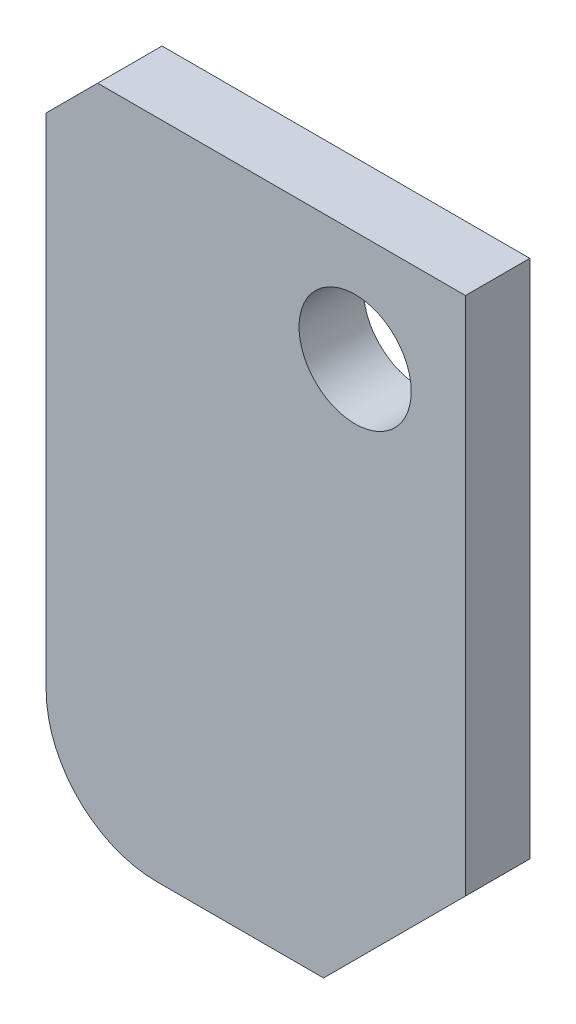
ISO-10303-21;
HEADER;
FILE_DESCRIPTION(('STEP AP214'),'2;1');
FILE_NAME('part.step','',(''),(''),'','','');
FILE_SCHEMA(('AUTOMOTIVE_DESIGN { 1 0 10303 214 1 1 1 1 }'));
ENDSEC;
DATA;
#1=APPLICATION_CONTEXT('core data for automotive mechanical design processes');
#2=APPLICATION_PROTOCOL_DEFINITION('international standard','automotive_design',2000,#1);
#3=PRODUCT_CONTEXT('',#1,'mechanical');
#4=PRODUCT('Part','Part','',(#3));
#5=PRODUCT_RELATED_PRODUCT_CATEGORY('part','',(#4));
#6=PRODUCT_DEFINITION_FORMATION('','',#4);
#7=PRODUCT_DEFINITION_CONTEXT('part definition',#1,'design');
#8=PRODUCT_DEFINITION('design','',#6,#7);
#9=PRODUCT_DEFINITION_SHAPE('','',#8);
#10=(LENGTH_UNIT() NAMED_UNIT(*) SI_UNIT(.MILLI.,.METRE.));
#11=(NAMED_UNIT(*) PLANE_ANGLE_UNIT() SI_UNIT($,.RADIAN.));
#12=(NAMED_UNIT(*) SI_UNIT($,.STERADIAN.) SOLID_ANGLE_UNIT());
#13=UNCERTAINTY_MEASURE_WITH_UNIT(LENGTH_MEASURE(1.E-05),#10,'distance_accuracy_value','');
#14=(GEOMETRIC_REPRESENTATION_CONTEXT(3) GLOBAL_UNCERTAINTY_ASSIGNED_CONTEXT((#13)) GLOBAL_UNIT_ASSIGNED_CONTEXT((#10,
#11,#12)) REPRESENTATION_CONTEXT('',''));
#15=CARTESIAN_POINT('',(0.,0.,0.));
#16=DIRECTION('',(0.,0.,1.));
#17=DIRECTION('',(1.,0.,0.));
#18=AXIS2_PLACEMENT_3D('',#15,#16,#17);
#19=CARTESIAN_POINT('',(0.,0.,1.75));
#20=DIRECTION('',(0.,0.,-1.));
#21=DIRECTION('',(-1.,0.,0.));
#22=AXIS2_PLACEMENT_3D('',#19,#20,#21);
#23=PLANE('',#22);
#24=DIRECTION('',(0.,1.,0.));
#25=VECTOR('',#24,1.);
#26=CARTESIAN_POINT('',(33.85,24.4000000000001,1.75));
#27=LINE('',#26,#25);
#28=CARTESIAN_POINT('',(33.85,10.8000000000049,1.75));
#29=VERTEX_POINT('',#28);
#30=CARTESIAN_POINT('',(33.85,24.4000000000001,1.75));
#31=VERTEX_POINT('',#30);
#32=EDGE_CURVE('E99',#29,#31,#27,.T.);
#33=ORIENTED_EDGE('',*,*,#32,.F.);
#34=CARTESIAN_POINT('',(36.85,10.8000000000049,1.75));
#35=DIRECTION('',(0.,0.,-1.));
#36=DIRECTION('',(-1.,0.,0.));
#37=AXIS2_PLACEMENT_3D('',#34,#35,#36);
#38=CIRCLE('',#37,3.);
#39=CARTESIAN_POINT('',(36.85,7.8000000000049,1.75));
#40=VERTEX_POINT('',#39);
#41=EDGE_CURVE('E49',#29,#40,#38,.F.);
#42=ORIENTED_EDGE('',*,*,#41,.T.);
#43=DIRECTION('',(1.,0.,0.));
#44=VECTOR('',#43,1.);
#45=CARTESIAN_POINT('',(33.85,7.80000000000486,1.75));
#46=LINE('',#45,#44);
#47=CARTESIAN_POINT('',(41.392135623737,7.80000000000496,1.75));
#48=VERTEX_POINT('',#47);
#49=EDGE_CURVE('E133',#40,#48,#46,.T.);
#50=ORIENTED_EDGE('',*,*,#49,.T.);
#51=DIRECTION('',(0.707106781186535,0.70710678118656,0.));
#52=VECTOR('',#51,1.);
#53=CARTESIAN_POINT('',(41.392135623737,7.80000000000496,1.75));
#54=LINE('',#53,#52);
#55=CARTESIAN_POINT('',(45.2500000000071,11.6578643762752,1.75));
#56=VERTEX_POINT('',#55);
#57=EDGE_CURVE('E140',#48,#56,#54,.T.);
#58=ORIENTED_EDGE('',*,*,#57,.T.);
#59=DIRECTION('',(0.,1.,0.));
#60=VECTOR('',#59,1.);
#61=CARTESIAN_POINT('',(45.2500000000071,11.6578643762752,1.75));
#62=LINE('',#61,#60);
#63=CARTESIAN_POINT('',(45.2500000000071,25.8000000000063,1.75));
#64=VERTEX_POINT('',#63);
#65=EDGE_CURVE('E179',#56,#64,#62,.T.);
#66=ORIENTED_EDGE('',*,*,#65,.T.);
#67=DIRECTION('',(-1.,0.,0.));
#68=VECTOR('',#67,1.);
#69=CARTESIAN_POINT('',(45.2500000000071,25.8000000000063,1.75));
#70=LINE('',#69,#68);
#71=CARTESIAN_POINT('',(35.2500000000062,25.8000000000063,1.75));
#72=VERTEX_POINT('',#71);
#73=EDGE_CURVE('E121',#64,#72,#70,.T.);
#74=ORIENTED_EDGE('',*,*,#73,.T.);
#75=DIRECTION('',(0.707106781186546,0.707106781186549,0.));
#76=VECTOR('',#75,1.);
#77=CARTESIAN_POINT('',(35.2500000000062,25.8000000000063,1.75));
#78=LINE('',#77,#76);
#79=EDGE_CURVE('E112',#72,#31,#78,.F.);
#80=ORIENTED_EDGE('',*,*,#79,.T.);
#81=EDGE_LOOP('',(#33,#42,#50,#58,#66,#74,#80));
#82=FACE_BOUND('',#81,.T.);
#83=CARTESIAN_POINT('',(42.2500000000071,22.8000000000063,1.75));
#84=DIRECTION('',(0.,0.,1.));
#85=DIRECTION('',(1.,0.,0.));
#86=AXIS2_PLACEMENT_3D('',#83,#84,#85);
#87=CIRCLE('',#86,1.52499999999776);
#88=CARTESIAN_POINT('',(43.7750000000048,22.8000000000063,1.75));
#89=VERTEX_POINT('',#88);
#90=EDGE_CURVE('E141',#89,#89,#87,.T.);
#91=ORIENTED_EDGE('',*,*,#90,.F.);
#92=EDGE_LOOP('',(#91));
#93=FACE_BOUND('',#92,.T.);
#94=ADVANCED_FACE('F41',(#82,#93),#23,.F.);
#95=CARTESIAN_POINT('',(0.,0.,0.));
#96=DIRECTION('',(0.,0.,-1.));
#97=DIRECTION('',(-1.,0.,0.));
#98=AXIS2_PLACEMENT_3D('',#95,#96,#97);
#99=PLANE('',#98);
#100=DIRECTION('',(1.,0.,0.));
#101=VECTOR('',#100,1.);
#102=CARTESIAN_POINT('',(33.85,7.80000000000486,0.));
#103=LINE('',#102,#101);
#104=CARTESIAN_POINT('',(36.85,7.8000000000049,0.));
#105=VERTEX_POINT('',#104);
#106=CARTESIAN_POINT('',(41.392135623737,7.80000000000496,0.));
#107=VERTEX_POINT('',#106);
#108=EDGE_CURVE('E193',#105,#107,#103,.T.);
#109=ORIENTED_EDGE('',*,*,#108,.F.);
#110=CARTESIAN_POINT('',(36.85,10.8000000000049,0.));
#111=DIRECTION('',(0.,0.,-1.));
#112=DIRECTION('',(-1.,0.,0.));
#113=AXIS2_PLACEMENT_3D('',#110,#111,#112);
#114=CIRCLE('',#113,3.);
#115=CARTESIAN_POINT('',(33.85,10.8000000000049,0.));
#116=VERTEX_POINT('',#115);
#117=EDGE_CURVE('E11',#105,#116,#114,.T.);
#118=ORIENTED_EDGE('',*,*,#117,.T.);
#119=DIRECTION('',(0.,1.,0.));
#120=VECTOR('',#119,1.);
#121=CARTESIAN_POINT('',(33.85,24.4000000000001,0.));
#122=LINE('',#121,#120);
#123=CARTESIAN_POINT('',(33.85,24.4000000000001,0.));
#124=VERTEX_POINT('',#123);
#125=EDGE_CURVE('E107',#116,#124,#122,.T.);
#126=ORIENTED_EDGE('',*,*,#125,.T.);
#127=DIRECTION('',(-0.707106781186546,-0.707106781186549,0.));
#128=VECTOR('',#127,1.);
#129=CARTESIAN_POINT('',(4.72500000000004,-4.72500000000002,0.));
#130=LINE('',#129,#128);
#131=CARTESIAN_POINT('',(35.2500000000062,25.8000000000063,0.));
#132=VERTEX_POINT('',#131);
#133=EDGE_CURVE('E114',#124,#132,#130,.F.);
#134=ORIENTED_EDGE('',*,*,#133,.T.);
#135=DIRECTION('',(-1.,0.,0.));
#136=VECTOR('',#135,1.);
#137=CARTESIAN_POINT('',(45.2500000000071,25.8000000000063,0.));
#138=LINE('',#137,#136);
#139=CARTESIAN_POINT('',(45.2500000000071,25.8000000000063,0.));
#140=VERTEX_POINT('',#139);
#141=EDGE_CURVE('E115',#140,#132,#138,.T.);
#142=ORIENTED_EDGE('',*,*,#141,.F.);
#143=DIRECTION('',(0.,1.,0.));
#144=VECTOR('',#143,1.);
#145=CARTESIAN_POINT('',(45.2500000000071,11.6578643762752,0.));
#146=LINE('',#145,#144);
#147=CARTESIAN_POINT('',(45.2500000000071,11.6578643762752,0.));
#148=VERTEX_POINT('',#147);
#149=EDGE_CURVE('E185',#148,#140,#146,.T.);
#150=ORIENTED_EDGE('',*,*,#149,.F.);
#151=DIRECTION('',(0.707106781186535,0.70710678118656,0.));
#152=VECTOR('',#151,1.);
#153=CARTESIAN_POINT('',(41.392135623737,7.80000000000496,0.));
#154=LINE('',#153,#152);
#155=EDGE_CURVE('E189',#107,#148,#154,.T.);
#156=ORIENTED_EDGE('',*,*,#155,.F.);
#157=EDGE_LOOP('',(#109,#118,#126,#134,#142,#150,#156));
#158=FACE_BOUND('',#157,.T.);
#159=CARTESIAN_POINT('',(42.2500000000071,22.8000000000063,0.));
#160=DIRECTION('',(0.,0.,-1.));
#161=DIRECTION('',(-1.,0.,0.));
#162=AXIS2_PLACEMENT_3D('',#159,#160,#161);
#163=CIRCLE('',#162,1.52499999999776);
#164=CARTESIAN_POINT('',(40.7250000000093,22.8000000000063,0.));
#165=VERTEX_POINT('',#164);
#166=EDGE_CURVE('E126',#165,#165,#163,.F.);
#167=ORIENTED_EDGE('',*,*,#166,.T.);
#168=EDGE_LOOP('',(#167));
#169=FACE_BOUND('',#168,.T.);
#170=ADVANCED_FACE('F149',(#158,#169),#99,.T.);
#171=CARTESIAN_POINT('',(45.2500000000071,25.8000000000063,-43.2199317445177));
#172=DIRECTION('',(0.,1.,0.));
#173=DIRECTION('',(-1.,0.,0.));
#174=AXIS2_PLACEMENT_3D('',#171,#172,#173);
#175=PLANE('',#174);
#176=ORIENTED_EDGE('',*,*,#141,.T.);
#177=DIRECTION('',(0.,0.,1.));
#178=VECTOR('',#177,1.);
#179=CARTESIAN_POINT('',(35.2500000000062,25.8000000000063,-43.2199317445177));
#180=LINE('',#179,#178);
#181=EDGE_CURVE('E122',#132,#72,#180,.T.);
#182=ORIENTED_EDGE('',*,*,#181,.T.);
#183=ORIENTED_EDGE('',*,*,#73,.F.);
#184=DIRECTION('',(0.,0.,1.));
#185=VECTOR('',#184,1.);
#186=CARTESIAN_POINT('',(45.2500000000071,25.8000000000063,-43.2199317445177));
#187=LINE('',#186,#185);
#188=EDGE_CURVE('E188',#140,#64,#187,.T.);
#189=ORIENTED_EDGE('',*,*,#188,.F.);
#190=EDGE_LOOP('',(#176,#182,#183,#189));
#191=FACE_BOUND('',#190,.T.);
#192=ADVANCED_FACE('F154',(#191),#175,.T.);
#193=CARTESIAN_POINT('',(45.2500000000071,11.6578643762752,-43.2199317445177));
#194=DIRECTION('',(1.,0.,0.));
#195=DIRECTION('',(0.,0.,-1.));
#196=AXIS2_PLACEMENT_3D('',#193,#194,#195);
#197=PLANE('',#196);
#198=DIRECTION('',(0.,0.,1.));
#199=VECTOR('',#198,1.);
#200=CARTESIAN_POINT('',(45.2500000000071,11.6578643762752,-43.2199317445177));
#201=LINE('',#200,#199);
#202=EDGE_CURVE('E192',#148,#56,#201,.T.);
#203=ORIENTED_EDGE('',*,*,#202,.F.);
#204=ORIENTED_EDGE('',*,*,#149,.T.);
#205=ORIENTED_EDGE('',*,*,#188,.T.);
#206=ORIENTED_EDGE('',*,*,#65,.F.);
#207=EDGE_LOOP('',(#203,#204,#205,#206));
#208=FACE_BOUND('',#207,.T.);
#209=ADVANCED_FACE('F201',(#208),#197,.T.);
#210=CARTESIAN_POINT('',(41.392135623737,7.80000000000496,-43.2199317445177));
#211=DIRECTION('',(0.70710678118656,-0.707106781186535,0.));
#212=DIRECTION('',(0.707106781186535,0.70710678118656,0.));
#213=AXIS2_PLACEMENT_3D('',#210,#211,#212);
#214=PLANE('',#213);
#215=DIRECTION('',(0.,0.,1.));
#216=VECTOR('',#215,1.);
#217=CARTESIAN_POINT('',(41.392135623737,7.80000000000496,-43.2199317445177));
#218=LINE('',#217,#216);
#219=EDGE_CURVE('E138',#107,#48,#218,.T.);
#220=ORIENTED_EDGE('',*,*,#219,.F.);
#221=ORIENTED_EDGE('',*,*,#155,.T.);
#222=ORIENTED_EDGE('',*,*,#202,.T.);
#223=ORIENTED_EDGE('',*,*,#57,.F.);
#224=EDGE_LOOP('',(#220,#221,#222,#223));
#225=FACE_BOUND('',#224,.T.);
#226=ADVANCED_FACE('F170',(#225),#214,.T.);
#227=CARTESIAN_POINT('',(33.85,7.80000000000486,-43.2199317445177));
#228=DIRECTION('',(0.,-1.,0.));
#229=DIRECTION('',(1.,0.,0.));
#230=AXIS2_PLACEMENT_3D('',#227,#228,#229);
#231=PLANE('',#230);
#232=ORIENTED_EDGE('',*,*,#49,.F.);
#233=DIRECTION('',(0.,0.,1.));
#234=VECTOR('',#233,1.);
#235=CARTESIAN_POINT('',(36.85,7.8000000000049,0.));
#236=LINE('',#235,#234);
#237=EDGE_CURVE('E124',#40,#105,#236,.F.);
#238=ORIENTED_EDGE('',*,*,#237,.T.);
#239=ORIENTED_EDGE('',*,*,#108,.T.);
#240=ORIENTED_EDGE('',*,*,#219,.T.);
#241=EDGE_LOOP('',(#232,#238,#239,#240));
#242=FACE_BOUND('',#241,.T.);
#243=ADVANCED_FACE('F136',(#242),#231,.T.);
#244=CARTESIAN_POINT('',(42.2500000000071,22.8000000000063,-43.2199317445177));
#245=DIRECTION('',(0.,0.,1.));
#246=DIRECTION('',(1.,0.,0.));
#247=AXIS2_PLACEMENT_3D('',#244,#245,#246);
#248=CYLINDRICAL_SURFACE('',#247,1.52499999999776);
#249=ORIENTED_EDGE('',*,*,#90,.T.);
#250=EDGE_LOOP('',(#249));
#251=FACE_BOUND('',#250,.T.);
#252=ORIENTED_EDGE('',*,*,#166,.F.);
#253=EDGE_LOOP('',(#252));
#254=FACE_BOUND('',#253,.T.);
#255=ADVANCED_FACE('F157',(#251,#254),#248,.F.);
#256=CARTESIAN_POINT('',(35.2500000000062,25.8000000000063,-43.2199317445177));
#257=DIRECTION('',(0.707106781186549,-0.707106781186546,0.));
#258=DIRECTION('',(0.,0.,1.));
#259=AXIS2_PLACEMENT_3D('',#256,#257,#258);
#260=PLANE('',#259);
#261=DIRECTION('',(0.,0.,1.));
#262=VECTOR('',#261,1.);
#263=CARTESIAN_POINT('',(33.85,24.4000000000001,-73.1360547199533));
#264=LINE('',#263,#262);
#265=EDGE_CURVE('E102',#124,#31,#264,.T.);
#266=ORIENTED_EDGE('',*,*,#265,.T.);
#267=ORIENTED_EDGE('',*,*,#79,.F.);
#268=ORIENTED_EDGE('',*,*,#181,.F.);
#269=ORIENTED_EDGE('',*,*,#133,.F.);
#270=EDGE_LOOP('',(#266,#267,#268,#269));
#271=FACE_BOUND('',#270,.T.);
#272=ADVANCED_FACE('F110',(#271),#260,.F.);
#273=CARTESIAN_POINT('',(33.85,24.4000000000001,-73.1360547199533));
#274=DIRECTION('',(1.,0.,0.));
#275=DIRECTION('',(0.,0.,-1.));
#276=AXIS2_PLACEMENT_3D('',#273,#274,#275);
#277=PLANE('',#276);
#278=ORIENTED_EDGE('',*,*,#125,.F.);
#279=DIRECTION('',(0.,0.,-1.));
#280=VECTOR('',#279,1.);
#281=CARTESIAN_POINT('',(33.85,10.8000000000049,-73.1360547199533));
#282=LINE('',#281,#280);
#283=EDGE_CURVE('E104',#116,#29,#282,.F.);
#284=ORIENTED_EDGE('',*,*,#283,.T.);
#285=ORIENTED_EDGE('',*,*,#32,.T.);
#286=ORIENTED_EDGE('',*,*,#265,.F.);
#287=EDGE_LOOP('',(#278,#284,#285,#286));
#288=FACE_BOUND('',#287,.T.);
#289=ADVANCED_FACE('F101',(#288),#277,.F.);
#290=CARTESIAN_POINT('',(36.85,10.8000000000049,-43.2199317445177));
#291=DIRECTION('',(0.,0.,-1.));
#292=DIRECTION('',(-1.,0.,0.));
#293=AXIS2_PLACEMENT_3D('',#290,#291,#292);
#294=CYLINDRICAL_SURFACE('',#293,3.);
#295=ORIENTED_EDGE('',*,*,#117,.F.);
#296=ORIENTED_EDGE('',*,*,#237,.F.);
#297=ORIENTED_EDGE('',*,*,#41,.F.);
#298=ORIENTED_EDGE('',*,*,#283,.F.);
#299=EDGE_LOOP('',(#295,#296,#297,#298));
#300=FACE_BOUND('',#299,.T.);
#301=ADVANCED_FACE('F43',(#300),#294,.T.);
#302=CLOSED_SHELL('',(#94,#170,#192,#209,#226,#243,#255,#272,#289,#301));
#303=MANIFOLD_SOLID_BREP('B2',#302);
#304=ADVANCED_BREP_SHAPE_REPRESENTATION('',(#18,#303),#14);
#305=SHAPE_DEFINITION_REPRESENTATION(#9,#304);
ENDSEC;
END-ISO-10303-21;
